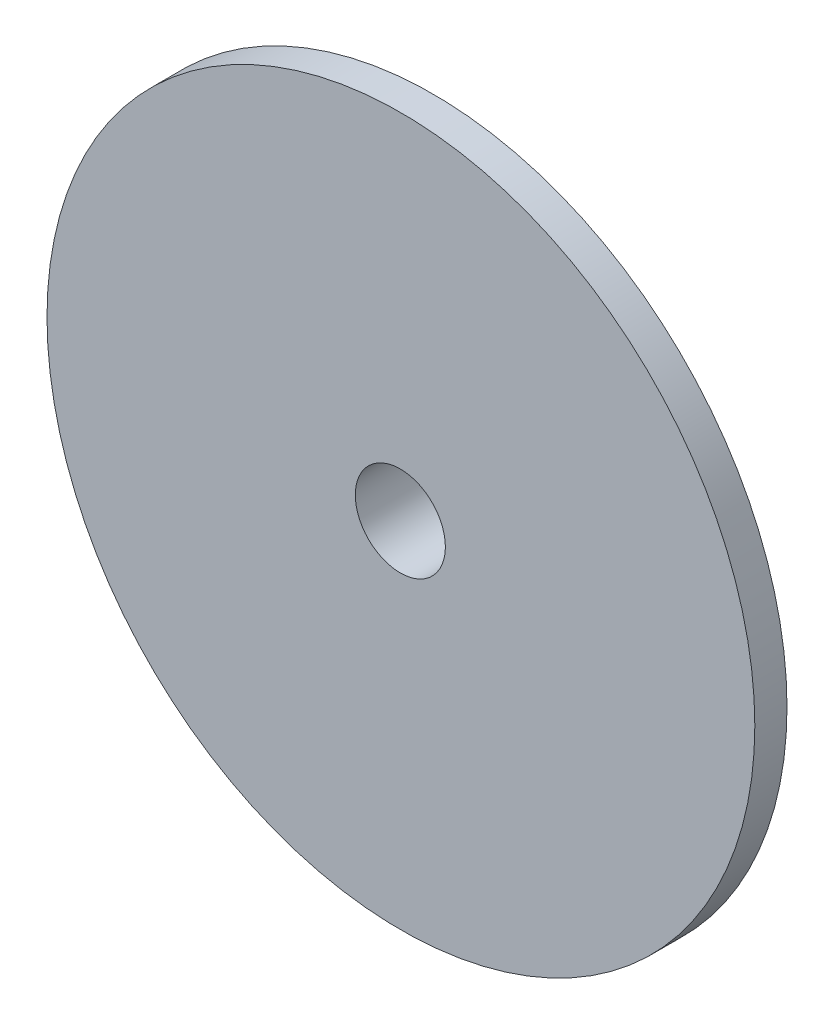
ISO-10303-21;
HEADER;
FILE_DESCRIPTION(('STEP AP214'),'2;1');
FILE_NAME('part.step','',(''),(''),'','','');
FILE_SCHEMA(('AUTOMOTIVE_DESIGN { 1 0 10303 214 1 1 1 1 }'));
ENDSEC;
DATA;
#1=APPLICATION_CONTEXT('core data for automotive mechanical design processes');
#2=APPLICATION_PROTOCOL_DEFINITION('international standard','automotive_design',2000,#1);
#3=PRODUCT_CONTEXT('',#1,'mechanical');
#4=PRODUCT('Part','Part','',(#3));
#5=PRODUCT_RELATED_PRODUCT_CATEGORY('part','',(#4));
#6=PRODUCT_DEFINITION_FORMATION('','',#4);
#7=PRODUCT_DEFINITION_CONTEXT('part definition',#1,'design');
#8=PRODUCT_DEFINITION('design','',#6,#7);
#9=PRODUCT_DEFINITION_SHAPE('','',#8);
#10=(LENGTH_UNIT() NAMED_UNIT(*) SI_UNIT(.MILLI.,.METRE.));
#11=(NAMED_UNIT(*) PLANE_ANGLE_UNIT() SI_UNIT($,.RADIAN.));
#12=(NAMED_UNIT(*) SI_UNIT($,.STERADIAN.) SOLID_ANGLE_UNIT());
#13=UNCERTAINTY_MEASURE_WITH_UNIT(LENGTH_MEASURE(1.E-05),#10,'distance_accuracy_value','');
#14=(GEOMETRIC_REPRESENTATION_CONTEXT(3) GLOBAL_UNCERTAINTY_ASSIGNED_CONTEXT((#13)) GLOBAL_UNIT_ASSIGNED_CONTEXT((#10,
#11,#12)) REPRESENTATION_CONTEXT('',''));
#15=CARTESIAN_POINT('',(0.,0.,0.));
#16=DIRECTION('',(0.,0.,1.));
#17=DIRECTION('',(1.,0.,0.));
#18=AXIS2_PLACEMENT_3D('',#15,#16,#17);
#19=CARTESIAN_POINT('',(-120.699770324593,50.1704441488946,-10.));
#20=DIRECTION('',(0.,0.,1.));
#21=DIRECTION('',(1.,0.,0.));
#22=AXIS2_PLACEMENT_3D('',#19,#20,#21);
#23=CYLINDRICAL_SURFACE('',#22,120.631252195269);
#24=CARTESIAN_POINT('',(-120.699770324593,50.1704441488946,0.));
#25=DIRECTION('',(0.,0.,1.));
#26=DIRECTION('',(1.,0.,0.));
#27=AXIS2_PLACEMENT_3D('',#24,#25,#26);
#28=CIRCLE('',#27,120.631252195269);
#29=CARTESIAN_POINT('',(-28.7441259415646,-27.9068154873179,0.));
#30=VERTEX_POINT('',#29);
#31=CARTESIAN_POINT('',(-0.505940955319046,39.9068001688853,0.));
#32=VERTEX_POINT('',#31);
#33=EDGE_CURVE('E66',#30,#32,#28,.T.);
#34=ORIENTED_EDGE('',*,*,#33,.T.);
#35=DIRECTION('',(0.,0.,1.));
#36=VECTOR('',#35,1.);
#37=CARTESIAN_POINT('',(-0.505940955319046,39.9068001688853,-10.));
#38=LINE('',#37,#36);
#39=CARTESIAN_POINT('',(-0.505940955319046,39.9068001688853,-10.));
#40=VERTEX_POINT('',#39);
#41=EDGE_CURVE('E11',#40,#32,#38,.T.);
#42=ORIENTED_EDGE('',*,*,#41,.F.);
#43=CARTESIAN_POINT('',(-120.699770324593,50.1704441488946,-10.));
#44=DIRECTION('',(0.,0.,1.));
#45=DIRECTION('',(1.,0.,0.));
#46=AXIS2_PLACEMENT_3D('',#43,#44,#45);
#47=CIRCLE('',#46,120.631252195269);
#48=CARTESIAN_POINT('',(-28.7441259415646,-27.9068154873179,-10.));
#49=VERTEX_POINT('',#48);
#50=EDGE_CURVE('E56',#49,#40,#47,.T.);
#51=ORIENTED_EDGE('',*,*,#50,.F.);
#52=DIRECTION('',(0.,0.,1.));
#53=VECTOR('',#52,1.);
#54=CARTESIAN_POINT('',(-28.7441259415646,-27.9068154873179,-10.));
#55=LINE('',#54,#53);
#56=EDGE_CURVE('E44',#49,#30,#55,.T.);
#57=ORIENTED_EDGE('',*,*,#56,.T.);
#58=EDGE_LOOP('',(#34,#42,#51,#57));
#59=FACE_BOUND('',#58,.T.);
#60=ADVANCED_FACE('F41',(#59),#23,.F.);
#61=CARTESIAN_POINT('',(-2.22044604925031E-13,-0.0899999999999512,-10.));
#62=DIRECTION('',(0.,0.,1.));
#63=DIRECTION('',(1.,0.,0.));
#64=AXIS2_PLACEMENT_3D('',#61,#62,#63);
#65=CYLINDRICAL_SURFACE('',#64,40.0000000000001);
#66=CARTESIAN_POINT('',(-2.22044604925031E-13,-0.0899999999999512,0.));
#67=DIRECTION('',(0.,0.,1.));
#68=DIRECTION('',(1.,0.,0.));
#69=AXIS2_PLACEMENT_3D('',#66,#67,#68);
#70=CIRCLE('',#69,40.0000000000001);
#71=EDGE_CURVE('E73',#30,#32,#70,.T.);
#72=ORIENTED_EDGE('',*,*,#71,.F.);
#73=ORIENTED_EDGE('',*,*,#56,.F.);
#74=CARTESIAN_POINT('',(-2.22044604925031E-13,-0.0899999999999512,-10.));
#75=DIRECTION('',(0.,0.,1.));
#76=DIRECTION('',(1.,0.,0.));
#77=AXIS2_PLACEMENT_3D('',#74,#75,#76);
#78=CIRCLE('',#77,40.0000000000001);
#79=EDGE_CURVE('E71',#49,#40,#78,.T.);
#80=ORIENTED_EDGE('',*,*,#79,.T.);
#81=ORIENTED_EDGE('',*,*,#41,.T.);
#82=EDGE_LOOP('',(#72,#73,#80,#81));
#83=FACE_BOUND('',#82,.T.);
#84=ADVANCED_FACE('F74',(#83),#65,.T.);
#85=CARTESIAN_POINT('',(0.,0.,-10.));
#86=DIRECTION('',(0.,0.,1.));
#87=DIRECTION('',(1.,0.,0.));
#88=AXIS2_PLACEMENT_3D('',#85,#86,#87);
#89=PLANE('',#88);
#90=CARTESIAN_POINT('',(0.,0.,-10.));
#91=DIRECTION('',(0.,0.,1.));
#92=DIRECTION('',(1.,0.,0.));
#93=AXIS2_PLACEMENT_3D('',#90,#91,#92);
#94=CIRCLE('',#93,7.);
#95=CARTESIAN_POINT('',(7.,0.,-10.));
#96=VERTEX_POINT('',#95);
#97=EDGE_CURVE('E99',#96,#96,#94,.T.);
#98=ORIENTED_EDGE('',*,*,#97,.T.);
#99=EDGE_LOOP('',(#98));
#100=FACE_BOUND('',#99,.T.);
#101=ORIENTED_EDGE('',*,*,#50,.T.);
#102=ORIENTED_EDGE('',*,*,#79,.F.);
#103=EDGE_LOOP('',(#101,#102));
#104=FACE_BOUND('',#103,.T.);
#105=ADVANCED_FACE('F111',(#100,#104),#89,.F.);
#106=CARTESIAN_POINT('',(0.0899999999999235,0.,0.));
#107=DIRECTION('',(0.,0.,1.));
#108=DIRECTION('',(1.,0.,0.));
#109=AXIS2_PLACEMENT_3D('',#106,#107,#108);
#110=PLANE('',#109);
#111=CARTESIAN_POINT('',(-46.1635816405843,19.2073709372542,0.));
#112=DIRECTION('',(0.,0.,1.));
#113=DIRECTION('',(1.,0.,0.));
#114=AXIS2_PLACEMENT_3D('',#111,#112,#113);
#115=CIRCLE('',#114,3.99999999999978);
#116=CARTESIAN_POINT('',(-42.1635816405845,19.2073709372542,0.));
#117=VERTEX_POINT('',#116);
#118=EDGE_CURVE('E95',#117,#117,#115,.T.);
#119=ORIENTED_EDGE('',*,*,#118,.T.);
#120=EDGE_LOOP('',(#119));
#121=FACE_BOUND('',#120,.T.);
#122=CARTESIAN_POINT('',(0.0899999999999235,0.,0.));
#123=DIRECTION('',(0.,0.,1.));
#124=DIRECTION('',(1.,0.,0.));
#125=AXIS2_PLACEMENT_3D('',#122,#123,#124);
#126=CIRCLE('',#125,54.9999999999999);
#127=CARTESIAN_POINT('',(55.0899999999999,0.,0.));
#128=VERTEX_POINT('',#127);
#129=EDGE_CURVE('E84',#128,#128,#126,.T.);
#130=ORIENTED_EDGE('',*,*,#129,.F.);
#131=EDGE_LOOP('',(#130));
#132=FACE_BOUND('',#131,.T.);
#133=ORIENTED_EDGE('',*,*,#33,.F.);
#134=ORIENTED_EDGE('',*,*,#71,.T.);
#135=EDGE_LOOP('',(#133,#134));
#136=FACE_BOUND('',#135,.T.);
#137=ADVANCED_FACE('F78',(#121,#132,#136),#110,.F.);
#138=CARTESIAN_POINT('',(0.0899999999999235,0.,5.));
#139=DIRECTION('',(0.,0.,-1.));
#140=DIRECTION('',(-1.,0.,0.));
#141=AXIS2_PLACEMENT_3D('',#138,#139,#140);
#142=CYLINDRICAL_SURFACE('',#141,54.9999999999999);
#143=CARTESIAN_POINT('',(0.0899999999999235,0.,5.));
#144=DIRECTION('',(0.,0.,1.));
#145=DIRECTION('',(1.,0.,0.));
#146=AXIS2_PLACEMENT_3D('',#143,#144,#145);
#147=CIRCLE('',#146,54.9999999999999);
#148=CARTESIAN_POINT('',(55.0899999999999,0.,5.));
#149=VERTEX_POINT('',#148);
#150=EDGE_CURVE('E80',#149,#149,#147,.T.);
#151=ORIENTED_EDGE('',*,*,#150,.F.);
#152=EDGE_LOOP('',(#151));
#153=FACE_BOUND('',#152,.T.);
#154=ORIENTED_EDGE('',*,*,#129,.T.);
#155=EDGE_LOOP('',(#154));
#156=FACE_BOUND('',#155,.T.);
#157=ADVANCED_FACE('F124',(#153,#156),#142,.T.);
#158=CARTESIAN_POINT('',(0.0899999999999235,0.,5.));
#159=DIRECTION('',(0.,0.,1.));
#160=DIRECTION('',(1.,0.,0.));
#161=AXIS2_PLACEMENT_3D('',#158,#159,#160);
#162=PLANE('',#161);
#163=CARTESIAN_POINT('',(0.,0.,5.));
#164=DIRECTION('',(0.,0.,1.));
#165=DIRECTION('',(1.,0.,0.));
#166=AXIS2_PLACEMENT_3D('',#163,#164,#165);
#167=CIRCLE('',#166,7.);
#168=CARTESIAN_POINT('',(7.,0.,5.));
#169=VERTEX_POINT('',#168);
#170=EDGE_CURVE('E103',#169,#169,#167,.T.);
#171=ORIENTED_EDGE('',*,*,#170,.F.);
#172=EDGE_LOOP('',(#171));
#173=FACE_BOUND('',#172,.T.);
#174=ORIENTED_EDGE('',*,*,#150,.T.);
#175=EDGE_LOOP('',(#174));
#176=FACE_BOUND('',#175,.T.);
#177=ADVANCED_FACE('F120',(#173,#176),#162,.T.);
#178=CARTESIAN_POINT('',(-46.1635816405843,19.2073709372542,-10.));
#179=DIRECTION('',(0.,0.,1.));
#180=DIRECTION('',(1.,0.,0.));
#181=AXIS2_PLACEMENT_3D('',#178,#179,#180);
#182=CYLINDRICAL_SURFACE('',#181,3.99999999999978);
#183=CARTESIAN_POINT('',(-46.1635816405843,19.2073709372542,-10.));
#184=DIRECTION('',(0.,0.,1.));
#185=DIRECTION('',(1.,0.,0.));
#186=AXIS2_PLACEMENT_3D('',#183,#184,#185);
#187=CIRCLE('',#186,3.99999999999978);
#188=CARTESIAN_POINT('',(-42.1635816405845,19.2073709372542,-10.));
#189=VERTEX_POINT('',#188);
#190=EDGE_CURVE('E93',#189,#189,#187,.T.);
#191=ORIENTED_EDGE('',*,*,#190,.T.);
#192=EDGE_LOOP('',(#191));
#193=FACE_BOUND('',#192,.T.);
#194=ORIENTED_EDGE('',*,*,#118,.F.);
#195=EDGE_LOOP('',(#194));
#196=FACE_BOUND('',#195,.T.);
#197=ADVANCED_FACE('F123',(#193,#196),#182,.T.);
#198=CARTESIAN_POINT('',(0.,0.,-10.));
#199=DIRECTION('',(0.,0.,1.));
#200=DIRECTION('',(1.,0.,0.));
#201=AXIS2_PLACEMENT_3D('',#198,#199,#200);
#202=PLANE('',#201);
#203=ORIENTED_EDGE('',*,*,#190,.F.);
#204=EDGE_LOOP('',(#203));
#205=FACE_BOUND('',#204,.T.);
#206=ADVANCED_FACE('F116',(#205),#202,.F.);
#207=CARTESIAN_POINT('',(0.,0.,-10.));
#208=DIRECTION('',(0.,0.,1.));
#209=DIRECTION('',(1.,0.,0.));
#210=AXIS2_PLACEMENT_3D('',#207,#208,#209);
#211=CYLINDRICAL_SURFACE('',#210,7.);
#212=ORIENTED_EDGE('',*,*,#97,.F.);
#213=EDGE_LOOP('',(#212));
#214=FACE_BOUND('',#213,.T.);
#215=ORIENTED_EDGE('',*,*,#170,.T.);
#216=EDGE_LOOP('',(#215));
#217=FACE_BOUND('',#216,.T.);
#218=ADVANCED_FACE('F113',(#214,#217),#211,.F.);
#219=CLOSED_SHELL('',(#60,#84,#105,#137,#157,#177,#197,#206,#218));
#220=MANIFOLD_SOLID_BREP('B2',#219);
#221=ADVANCED_BREP_SHAPE_REPRESENTATION('',(#18,#220),#14);
#222=SHAPE_DEFINITION_REPRESENTATION(#9,#221);
ENDSEC;
END-ISO-10303-21;
